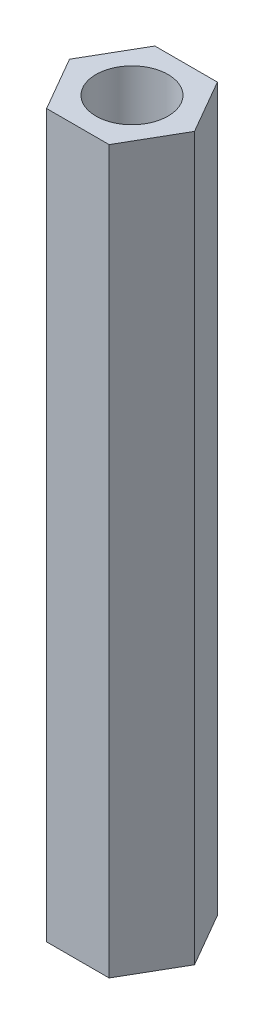
ISO-10303-21;
HEADER;
FILE_DESCRIPTION(('STEP AP214'),'2;1');
FILE_NAME('part.step','',(''),(''),'','','');
FILE_SCHEMA(('AUTOMOTIVE_DESIGN { 1 0 10303 214 1 1 1 1 }'));
ENDSEC;
DATA;
#1=APPLICATION_CONTEXT('core data for automotive mechanical design processes');
#2=APPLICATION_PROTOCOL_DEFINITION('international standard','automotive_design',2000,#1);
#3=PRODUCT_CONTEXT('',#1,'mechanical');
#4=PRODUCT('Part','Part','',(#3));
#5=PRODUCT_RELATED_PRODUCT_CATEGORY('part','',(#4));
#6=PRODUCT_DEFINITION_FORMATION('','',#4);
#7=PRODUCT_DEFINITION_CONTEXT('part definition',#1,'design');
#8=PRODUCT_DEFINITION('design','',#6,#7);
#9=PRODUCT_DEFINITION_SHAPE('','',#8);
#10=(LENGTH_UNIT() NAMED_UNIT(*) SI_UNIT(.MILLI.,.METRE.));
#11=(NAMED_UNIT(*) PLANE_ANGLE_UNIT() SI_UNIT($,.RADIAN.));
#12=(NAMED_UNIT(*) SI_UNIT($,.STERADIAN.) SOLID_ANGLE_UNIT());
#13=UNCERTAINTY_MEASURE_WITH_UNIT(LENGTH_MEASURE(1.E-05),#10,'distance_accuracy_value','');
#14=(GEOMETRIC_REPRESENTATION_CONTEXT(3) GLOBAL_UNCERTAINTY_ASSIGNED_CONTEXT((#13)) GLOBAL_UNIT_ASSIGNED_CONTEXT((#10,
#11,#12)) REPRESENTATION_CONTEXT('',''));
#15=CARTESIAN_POINT('',(0.,0.,0.));
#16=DIRECTION('',(0.,0.,1.));
#17=DIRECTION('',(1.,0.,0.));
#18=AXIS2_PLACEMENT_3D('',#15,#16,#17);
#19=CARTESIAN_POINT('',(0.,40.,0.));
#20=DIRECTION('',(0.,-1.,0.));
#21=DIRECTION('',(0.,0.,-1.));
#22=AXIS2_PLACEMENT_3D('',#19,#20,#21);
#23=PLANE('',#22);
#24=DIRECTION('',(-1.,0.,-2.11468338420375E-13));
#25=VECTOR('',#24,1.);
#26=CARTESIAN_POINT('',(-1.73,40.,-3.));
#27=LINE('',#26,#25);
#28=CARTESIAN_POINT('',(1.73205080756874,40.,-3.));
#29=VERTEX_POINT('',#28);
#30=CARTESIAN_POINT('',(-1.7320508075688,40.,-3.));
#31=VERTEX_POINT('',#30);
#32=EDGE_CURVE('E132',#29,#31,#27,.T.);
#33=ORIENTED_EDGE('',*,*,#32,.T.);
#34=DIRECTION('',(-0.500000000000631,0.,0.866025403784075));
#35=VECTOR('',#34,1.);
#36=CARTESIAN_POINT('',(-1.73307621135317,40.,-2.99822394854719));
#37=LINE('',#36,#35);
#38=CARTESIAN_POINT('',(-3.46410161513757,40.,-1.8496126205445E-13));
#39=VERTEX_POINT('',#38);
#40=EDGE_CURVE('E85',#31,#39,#37,.T.);
#41=ORIENTED_EDGE('',*,*,#40,.T.);
#42=DIRECTION('',(0.499999999999564,0.,0.86602540378469));
#43=VECTOR('',#42,1.);
#44=CARTESIAN_POINT('',(-3.4630762113532,40.,0.00177605145262248));
#45=LINE('',#44,#43);
#46=CARTESIAN_POINT('',(-1.7320508075688,40.,2.99999999999963));
#47=VERTEX_POINT('',#46);
#48=EDGE_CURVE('E99',#39,#47,#45,.T.);
#49=ORIENTED_EDGE('',*,*,#48,.T.);
#50=DIRECTION('',(1.,0.,2.11468338426412E-13));
#51=VECTOR('',#50,1.);
#52=CARTESIAN_POINT('',(-1.73000000000006,40.,2.99999999999963));
#53=LINE('',#52,#51);
#54=CARTESIAN_POINT('',(1.73205080756874,40.,2.99999999999963));
#55=VERTEX_POINT('',#54);
#56=EDGE_CURVE('E92',#47,#55,#53,.T.);
#57=ORIENTED_EDGE('',*,*,#56,.T.);
#58=DIRECTION('',(0.500000000000204,0.,-0.866025403784321));
#59=VECTOR('',#58,1.);
#60=CARTESIAN_POINT('',(1.73307621135311,40.,2.99822394854683));
#61=LINE('',#60,#59);
#62=CARTESIAN_POINT('',(3.46410161513751,40.,-1.83481890989844E-13));
#63=VERTEX_POINT('',#62);
#64=EDGE_CURVE('E96',#55,#63,#61,.T.);
#65=ORIENTED_EDGE('',*,*,#64,.T.);
#66=DIRECTION('',(-0.499999999999727,0.,-0.866025403784596));
#67=VECTOR('',#66,1.);
#68=CARTESIAN_POINT('',(3.46307621135314,40.,-0.00177605145298789));
#69=LINE('',#68,#67);
#70=EDGE_CURVE('E52',#63,#29,#69,.T.);
#71=ORIENTED_EDGE('',*,*,#70,.T.);
#72=EDGE_LOOP('',(#33,#41,#49,#57,#65,#71));
#73=FACE_BOUND('',#72,.T.);
#74=CARTESIAN_POINT('',(0.,40.,0.));
#75=DIRECTION('',(0.,1.,0.));
#76=DIRECTION('',(0.,0.,1.));
#77=AXIS2_PLACEMENT_3D('',#74,#75,#76);
#78=CIRCLE('',#77,2.);
#79=CARTESIAN_POINT('',(0.,40.,2.));
#80=VERTEX_POINT('',#79);
#81=EDGE_CURVE('E124',#80,#80,#78,.T.);
#82=ORIENTED_EDGE('',*,*,#81,.F.);
#83=EDGE_LOOP('',(#82));
#84=FACE_BOUND('',#83,.T.);
#85=ADVANCED_FACE('F35',(#73,#84),#23,.F.);
#86=CARTESIAN_POINT('',(0.,0.,0.));
#87=DIRECTION('',(0.,-1.,0.));
#88=DIRECTION('',(0.,0.,-1.));
#89=AXIS2_PLACEMENT_3D('',#86,#87,#88);
#90=PLANE('',#89);
#91=DIRECTION('',(-0.500000000001374,0.,0.866025403783645));
#92=VECTOR('',#91,1.);
#93=CARTESIAN_POINT('',(-3.46307621135317,0.,-0.00177605145303566));
#94=LINE('',#93,#92);
#95=CARTESIAN_POINT('',(-1.7320508075688,0.,-3.));
#96=VERTEX_POINT('',#95);
#97=CARTESIAN_POINT('',(-3.46410161513757,0.,-1.8496126205445E-13));
#98=VERTEX_POINT('',#97);
#99=EDGE_CURVE('E120',#96,#98,#94,.T.);
#100=ORIENTED_EDGE('',*,*,#99,.F.);
#101=DIRECTION('',(-1.,0.,0.));
#102=VECTOR('',#101,1.);
#103=CARTESIAN_POINT('',(-1.73,0.,-3.));
#104=LINE('',#103,#102);
#105=CARTESIAN_POINT('',(1.73205080756874,0.,-3.));
#106=VERTEX_POINT('',#105);
#107=EDGE_CURVE('E78',#106,#96,#104,.T.);
#108=ORIENTED_EDGE('',*,*,#107,.F.);
#109=DIRECTION('',(-0.499999999999379,0.,-0.866025403784797));
#110=VECTOR('',#109,1.);
#111=CARTESIAN_POINT('',(1.73307621135314,0.,-2.99822394854714));
#112=LINE('',#111,#110);
#113=CARTESIAN_POINT('',(3.46410161513751,0.,-1.83481890989844E-13));
#114=VERTEX_POINT('',#113);
#115=EDGE_CURVE('E74',#114,#106,#112,.T.);
#116=ORIENTED_EDGE('',*,*,#115,.F.);
#117=DIRECTION('',(0.500000000000076,0.,-0.866025403784395));
#118=VECTOR('',#117,1.);
#119=CARTESIAN_POINT('',(3.46307621135311,0.,0.00177605145267111));
#120=LINE('',#119,#118);
#121=CARTESIAN_POINT('',(1.73205080756874,0.,2.99999999999963));
#122=VERTEX_POINT('',#121);
#123=EDGE_CURVE('E128',#122,#114,#120,.T.);
#124=ORIENTED_EDGE('',*,*,#123,.F.);
#125=DIRECTION('',(1.,0.,0.));
#126=VECTOR('',#125,1.);
#127=CARTESIAN_POINT('',(1.72999999999994,0.,2.99999999999963));
#128=LINE('',#127,#126);
#129=CARTESIAN_POINT('',(-1.7320508075688,0.,2.99999999999963));
#130=VERTEX_POINT('',#129);
#131=EDGE_CURVE('E108',#130,#122,#128,.T.);
#132=ORIENTED_EDGE('',*,*,#131,.F.);
#133=DIRECTION('',(0.499999999999867,0.,0.866025403784516));
#134=VECTOR('',#133,1.);
#135=CARTESIAN_POINT('',(-1.7330762113532,0.,2.99822394854678));
#136=LINE('',#135,#134);
#137=EDGE_CURVE('E123',#98,#130,#136,.T.);
#138=ORIENTED_EDGE('',*,*,#137,.F.);
#139=EDGE_LOOP('',(#100,#108,#116,#124,#132,#138));
#140=FACE_BOUND('',#139,.T.);
#141=CARTESIAN_POINT('',(0.,0.,0.));
#142=DIRECTION('',(0.,1.,0.));
#143=DIRECTION('',(0.,0.,1.));
#144=AXIS2_PLACEMENT_3D('',#141,#142,#143);
#145=CIRCLE('',#144,2.);
#146=CARTESIAN_POINT('',(0.,0.,2.));
#147=VERTEX_POINT('',#146);
#148=EDGE_CURVE('E172',#147,#147,#145,.T.);
#149=ORIENTED_EDGE('',*,*,#148,.T.);
#150=EDGE_LOOP('',(#149));
#151=FACE_BOUND('',#150,.T.);
#152=ADVANCED_FACE('F140',(#140,#151),#90,.T.);
#153=CARTESIAN_POINT('',(-3.46307621135317,40.,-0.00177605145303566));
#154=DIRECTION('',(0.866025403783645,0.,0.500000000001374));
#155=DIRECTION('',(0.500000000001374,0.,-0.866025403783645));
#156=AXIS2_PLACEMENT_3D('',#153,#154,#155);
#157=PLANE('',#156);
#158=ORIENTED_EDGE('',*,*,#99,.T.);
#159=DIRECTION('',(0.,-1.,0.));
#160=VECTOR('',#159,1.);
#161=CARTESIAN_POINT('',(-3.46410161513757,40.,-1.8496126205445E-13));
#162=LINE('',#161,#160);
#163=EDGE_CURVE('E44',#39,#98,#162,.T.);
#164=ORIENTED_EDGE('',*,*,#163,.F.);
#165=ORIENTED_EDGE('',*,*,#40,.F.);
#166=DIRECTION('',(0.,-1.,0.));
#167=VECTOR('',#166,1.);
#168=CARTESIAN_POINT('',(-1.7320508075688,40.,-3.));
#169=LINE('',#168,#167);
#170=EDGE_CURVE('E11',#31,#96,#169,.T.);
#171=ORIENTED_EDGE('',*,*,#170,.T.);
#172=EDGE_LOOP('',(#158,#164,#165,#171));
#173=FACE_BOUND('',#172,.T.);
#174=ADVANCED_FACE('F37',(#173),#157,.F.);
#175=CARTESIAN_POINT('',(-1.7330762113532,40.,2.99822394854678));
#176=DIRECTION('',(0.866025403784516,0.,-0.499999999999867));
#177=DIRECTION('',(-0.499999999999867,0.,-0.866025403784516));
#178=AXIS2_PLACEMENT_3D('',#175,#176,#177);
#179=PLANE('',#178);
#180=ORIENTED_EDGE('',*,*,#137,.T.);
#181=DIRECTION('',(0.,-1.,0.));
#182=VECTOR('',#181,1.);
#183=CARTESIAN_POINT('',(-1.7320508075688,40.,2.99999999999963));
#184=LINE('',#183,#182);
#185=EDGE_CURVE('E110',#47,#130,#184,.T.);
#186=ORIENTED_EDGE('',*,*,#185,.F.);
#187=ORIENTED_EDGE('',*,*,#48,.F.);
#188=ORIENTED_EDGE('',*,*,#163,.T.);
#189=EDGE_LOOP('',(#180,#186,#187,#188));
#190=FACE_BOUND('',#189,.T.);
#191=ADVANCED_FACE('F138',(#190),#179,.F.);
#192=CARTESIAN_POINT('',(1.72999999999994,40.,2.99999999999963));
#193=DIRECTION('',(0.,0.,-1.));
#194=DIRECTION('',(-1.,0.,0.));
#195=AXIS2_PLACEMENT_3D('',#192,#193,#194);
#196=PLANE('',#195);
#197=ORIENTED_EDGE('',*,*,#131,.T.);
#198=DIRECTION('',(0.,-1.,0.));
#199=VECTOR('',#198,1.);
#200=CARTESIAN_POINT('',(1.73205080756874,40.,2.99999999999963));
#201=LINE('',#200,#199);
#202=EDGE_CURVE('E106',#55,#122,#201,.T.);
#203=ORIENTED_EDGE('',*,*,#202,.F.);
#204=ORIENTED_EDGE('',*,*,#56,.F.);
#205=ORIENTED_EDGE('',*,*,#185,.T.);
#206=EDGE_LOOP('',(#197,#203,#204,#205));
#207=FACE_BOUND('',#206,.T.);
#208=ADVANCED_FACE('F107',(#207),#196,.F.);
#209=CARTESIAN_POINT('',(3.46307621135311,40.,0.00177605145267111));
#210=DIRECTION('',(-0.866025403784395,0.,-0.500000000000076));
#211=DIRECTION('',(-0.500000000000076,0.,0.866025403784395));
#212=AXIS2_PLACEMENT_3D('',#209,#210,#211);
#213=PLANE('',#212);
#214=ORIENTED_EDGE('',*,*,#123,.T.);
#215=DIRECTION('',(0.,-1.,0.));
#216=VECTOR('',#215,1.);
#217=CARTESIAN_POINT('',(3.46410161513751,40.,-1.83481890989844E-13));
#218=LINE('',#217,#216);
#219=EDGE_CURVE('E111',#63,#114,#218,.T.);
#220=ORIENTED_EDGE('',*,*,#219,.F.);
#221=ORIENTED_EDGE('',*,*,#64,.F.);
#222=ORIENTED_EDGE('',*,*,#202,.T.);
#223=EDGE_LOOP('',(#214,#220,#221,#222));
#224=FACE_BOUND('',#223,.T.);
#225=ADVANCED_FACE('F113',(#224),#213,.F.);
#226=CARTESIAN_POINT('',(1.73307621135314,40.,-2.99822394854714));
#227=DIRECTION('',(-0.866025403784797,0.,0.499999999999379));
#228=DIRECTION('',(0.499999999999379,0.,0.866025403784797));
#229=AXIS2_PLACEMENT_3D('',#226,#227,#228);
#230=PLANE('',#229);
#231=ORIENTED_EDGE('',*,*,#115,.T.);
#232=DIRECTION('',(0.,-1.,0.));
#233=VECTOR('',#232,1.);
#234=CARTESIAN_POINT('',(1.73205080756874,40.,-3.));
#235=LINE('',#234,#233);
#236=EDGE_CURVE('E116',#29,#106,#235,.T.);
#237=ORIENTED_EDGE('',*,*,#236,.F.);
#238=ORIENTED_EDGE('',*,*,#70,.F.);
#239=ORIENTED_EDGE('',*,*,#219,.T.);
#240=EDGE_LOOP('',(#231,#237,#238,#239));
#241=FACE_BOUND('',#240,.T.);
#242=ADVANCED_FACE('F146',(#241),#230,.F.);
#243=CARTESIAN_POINT('',(-1.73,40.,-3.));
#244=DIRECTION('',(0.,0.,1.));
#245=DIRECTION('',(1.,0.,0.));
#246=AXIS2_PLACEMENT_3D('',#243,#244,#245);
#247=PLANE('',#246);
#248=ORIENTED_EDGE('',*,*,#107,.T.);
#249=ORIENTED_EDGE('',*,*,#170,.F.);
#250=ORIENTED_EDGE('',*,*,#32,.F.);
#251=ORIENTED_EDGE('',*,*,#236,.T.);
#252=EDGE_LOOP('',(#248,#249,#250,#251));
#253=FACE_BOUND('',#252,.T.);
#254=ADVANCED_FACE('F143',(#253),#247,.F.);
#255=CARTESIAN_POINT('',(0.,40.,0.));
#256=DIRECTION('',(0.,-1.,0.));
#257=DIRECTION('',(0.,0.,-1.));
#258=AXIS2_PLACEMENT_3D('',#255,#256,#257);
#259=CYLINDRICAL_SURFACE('',#258,2.);
#260=ORIENTED_EDGE('',*,*,#81,.T.);
#261=EDGE_LOOP('',(#260));
#262=FACE_BOUND('',#261,.T.);
#263=ORIENTED_EDGE('',*,*,#148,.F.);
#264=EDGE_LOOP('',(#263));
#265=FACE_BOUND('',#264,.T.);
#266=ADVANCED_FACE('F153',(#262,#265),#259,.F.);
#267=CLOSED_SHELL('',(#85,#152,#174,#191,#208,#225,#242,#254,#266));
#268=MANIFOLD_SOLID_BREP('B2',#267);
#269=ADVANCED_BREP_SHAPE_REPRESENTATION('',(#18,#268),#14);
#270=SHAPE_DEFINITION_REPRESENTATION(#9,#269);
ENDSEC;
END-ISO-10303-21;
